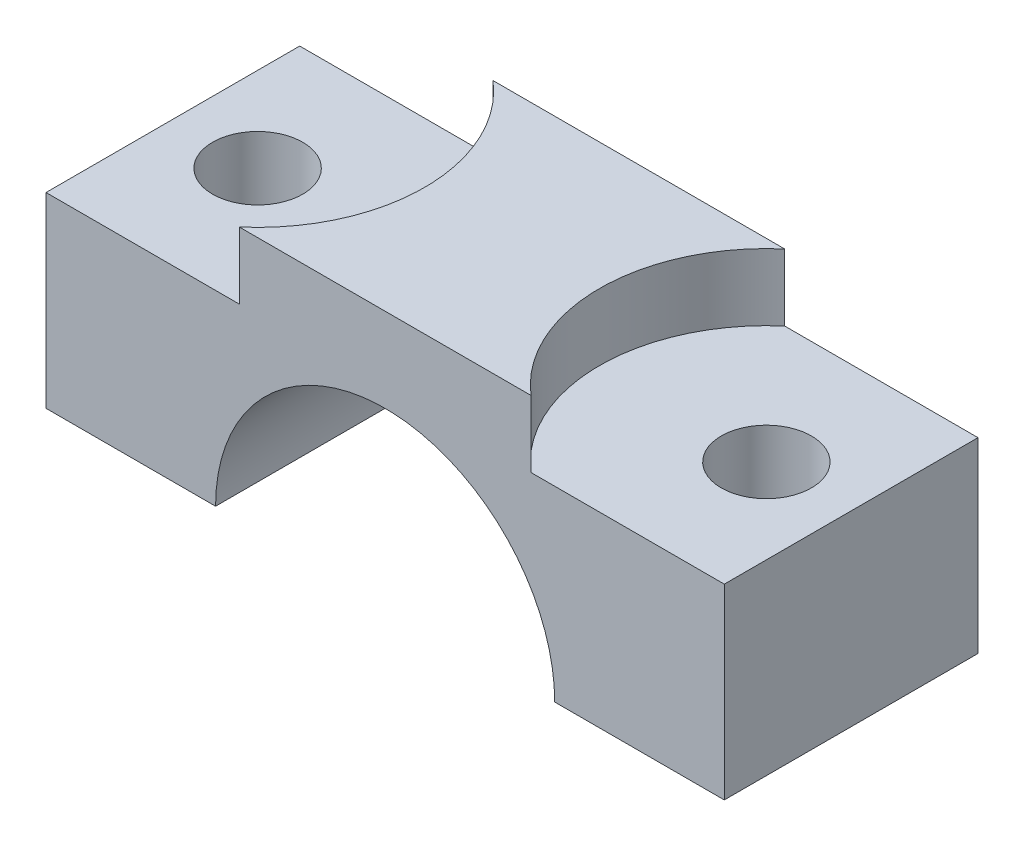
ISO-10303-21;
HEADER;
FILE_DESCRIPTION(('STEP AP214'),'2;1');
FILE_NAME('part.step','',(''),(''),'','','');
FILE_SCHEMA(('AUTOMOTIVE_DESIGN { 1 0 10303 214 1 1 1 1 }'));
ENDSEC;
DATA;
#1=APPLICATION_CONTEXT('core data for automotive mechanical design processes');
#2=APPLICATION_PROTOCOL_DEFINITION('international standard','automotive_design',2000,#1);
#3=PRODUCT_CONTEXT('',#1,'mechanical');
#4=PRODUCT('Part','Part','',(#3));
#5=PRODUCT_RELATED_PRODUCT_CATEGORY('part','',(#4));
#6=PRODUCT_DEFINITION_FORMATION('','',#4);
#7=PRODUCT_DEFINITION_CONTEXT('part definition',#1,'design');
#8=PRODUCT_DEFINITION('design','',#6,#7);
#9=PRODUCT_DEFINITION_SHAPE('','',#8);
#10=(LENGTH_UNIT() NAMED_UNIT(*) SI_UNIT(.MILLI.,.METRE.));
#11=(NAMED_UNIT(*) PLANE_ANGLE_UNIT() SI_UNIT($,.RADIAN.));
#12=(NAMED_UNIT(*) SI_UNIT($,.STERADIAN.) SOLID_ANGLE_UNIT());
#13=UNCERTAINTY_MEASURE_WITH_UNIT(LENGTH_MEASURE(1.E-05),#10,'distance_accuracy_value','');
#14=(GEOMETRIC_REPRESENTATION_CONTEXT(3) GLOBAL_UNCERTAINTY_ASSIGNED_CONTEXT((#13)) GLOBAL_UNIT_ASSIGNED_CONTEXT((#10,
#11,#12)) REPRESENTATION_CONTEXT('',''));
#15=CARTESIAN_POINT('',(0.,0.,0.));
#16=DIRECTION('',(0.,0.,1.));
#17=DIRECTION('',(1.,0.,0.));
#18=AXIS2_PLACEMENT_3D('',#15,#16,#17);
#19=CARTESIAN_POINT('',(-25.4,0.,9.5));
#20=DIRECTION('',(-1.,0.,0.));
#21=DIRECTION('',(0.,0.,1.));
#22=AXIS2_PLACEMENT_3D('',#19,#20,#21);
#23=PLANE('',#22);
#24=DIRECTION('',(0.,0.,1.));
#25=VECTOR('',#24,1.);
#26=CARTESIAN_POINT('',(-25.4,14.,9.5));
#27=LINE('',#26,#25);
#28=CARTESIAN_POINT('',(-25.4,14.,-9.5));
#29=VERTEX_POINT('',#28);
#30=CARTESIAN_POINT('',(-25.4,14.,9.5));
#31=VERTEX_POINT('',#30);
#32=EDGE_CURVE('E146',#29,#31,#27,.T.);
#33=ORIENTED_EDGE('',*,*,#32,.F.);
#34=DIRECTION('',(0.,1.,0.));
#35=VECTOR('',#34,1.);
#36=CARTESIAN_POINT('',(-25.4,0.,-9.5));
#37=LINE('',#36,#35);
#38=CARTESIAN_POINT('',(-25.4,0.,-9.5));
#39=VERTEX_POINT('',#38);
#40=EDGE_CURVE('E150',#39,#29,#37,.T.);
#41=ORIENTED_EDGE('',*,*,#40,.F.);
#42=DIRECTION('',(0.,0.,-1.));
#43=VECTOR('',#42,1.);
#44=CARTESIAN_POINT('',(-25.4,0.,9.5));
#45=LINE('',#44,#43);
#46=CARTESIAN_POINT('',(-25.4,0.,9.5));
#47=VERTEX_POINT('',#46);
#48=EDGE_CURVE('E178',#47,#39,#45,.T.);
#49=ORIENTED_EDGE('',*,*,#48,.F.);
#50=DIRECTION('',(0.,1.,0.));
#51=VECTOR('',#50,1.);
#52=CARTESIAN_POINT('',(-25.4,0.,9.5));
#53=LINE('',#52,#51);
#54=EDGE_CURVE('E151',#47,#31,#53,.T.);
#55=ORIENTED_EDGE('',*,*,#54,.T.);
#56=EDGE_LOOP('',(#33,#41,#49,#55));
#57=FACE_BOUND('',#56,.T.);
#58=ADVANCED_FACE('F36',(#57),#23,.T.);
#59=CARTESIAN_POINT('',(-25.4,0.,9.5));
#60=DIRECTION('',(0.,1.,0.));
#61=DIRECTION('',(0.,0.,1.));
#62=AXIS2_PLACEMENT_3D('',#59,#60,#61);
#63=PLANE('',#62);
#64=CARTESIAN_POINT('',(-19.05,0.,0.));
#65=DIRECTION('',(0.,1.,0.));
#66=DIRECTION('',(0.,0.,1.));
#67=AXIS2_PLACEMENT_3D('',#64,#65,#66);
#68=CIRCLE('',#67,3.375);
#69=CARTESIAN_POINT('',(-19.05,0.,3.375));
#70=VERTEX_POINT('',#69);
#71=EDGE_CURVE('E141',#70,#70,#68,.T.);
#72=ORIENTED_EDGE('',*,*,#71,.T.);
#73=EDGE_LOOP('',(#72));
#74=FACE_BOUND('',#73,.T.);
#75=DIRECTION('',(1.,0.,0.));
#76=VECTOR('',#75,1.);
#77=CARTESIAN_POINT('',(-25.4,0.,-9.5));
#78=LINE('',#77,#76);
#79=CARTESIAN_POINT('',(-12.7,0.,-9.5));
#80=VERTEX_POINT('',#79);
#81=EDGE_CURVE('E155',#39,#80,#78,.T.);
#82=ORIENTED_EDGE('',*,*,#81,.T.);
#83=DIRECTION('',(0.,0.,-1.));
#84=VECTOR('',#83,1.);
#85=CARTESIAN_POINT('',(-12.7,0.,9.5));
#86=LINE('',#85,#84);
#87=CARTESIAN_POINT('',(-12.7,0.,9.5));
#88=VERTEX_POINT('',#87);
#89=EDGE_CURVE('E181',#88,#80,#86,.T.);
#90=ORIENTED_EDGE('',*,*,#89,.F.);
#91=DIRECTION('',(1.,0.,0.));
#92=VECTOR('',#91,1.);
#93=CARTESIAN_POINT('',(-25.4,0.,9.5));
#94=LINE('',#93,#92);
#95=EDGE_CURVE('E162',#47,#88,#94,.T.);
#96=ORIENTED_EDGE('',*,*,#95,.F.);
#97=ORIENTED_EDGE('',*,*,#48,.T.);
#98=EDGE_LOOP('',(#82,#90,#96,#97));
#99=FACE_BOUND('',#98,.T.);
#100=ADVANCED_FACE('F214',(#74,#99),#63,.F.);
#101=CARTESIAN_POINT('',(0.,0.,9.5));
#102=DIRECTION('',(0.,0.,-1.));
#103=DIRECTION('',(-1.,0.,0.));
#104=AXIS2_PLACEMENT_3D('',#101,#102,#103);
#105=CYLINDRICAL_SURFACE('',#104,12.7);
#106=CARTESIAN_POINT('',(0.,0.,-9.5));
#107=DIRECTION('',(0.,0.,-1.));
#108=DIRECTION('',(-1.,0.,0.));
#109=AXIS2_PLACEMENT_3D('',#106,#107,#108);
#110=CIRCLE('',#109,12.7);
#111=CARTESIAN_POINT('',(12.7,0.,-9.5));
#112=VERTEX_POINT('',#111);
#113=EDGE_CURVE('E175',#80,#112,#110,.T.);
#114=ORIENTED_EDGE('',*,*,#113,.T.);
#115=DIRECTION('',(0.,0.,-1.));
#116=VECTOR('',#115,1.);
#117=CARTESIAN_POINT('',(12.7,0.,9.5));
#118=LINE('',#117,#116);
#119=CARTESIAN_POINT('',(12.7,0.,9.5));
#120=VERTEX_POINT('',#119);
#121=EDGE_CURVE('E184',#120,#112,#118,.T.);
#122=ORIENTED_EDGE('',*,*,#121,.F.);
#123=CARTESIAN_POINT('',(0.,0.,9.5));
#124=DIRECTION('',(0.,0.,-1.));
#125=DIRECTION('',(-1.,0.,0.));
#126=AXIS2_PLACEMENT_3D('',#123,#124,#125);
#127=CIRCLE('',#126,12.7);
#128=EDGE_CURVE('E160',#88,#120,#127,.T.);
#129=ORIENTED_EDGE('',*,*,#128,.F.);
#130=ORIENTED_EDGE('',*,*,#89,.T.);
#131=EDGE_LOOP('',(#114,#122,#129,#130));
#132=FACE_BOUND('',#131,.T.);
#133=ADVANCED_FACE('F220',(#132),#105,.F.);
#134=CARTESIAN_POINT('',(12.7,0.,9.5));
#135=DIRECTION('',(0.,1.,0.));
#136=DIRECTION('',(0.,0.,1.));
#137=AXIS2_PLACEMENT_3D('',#134,#135,#136);
#138=PLANE('',#137);
#139=CARTESIAN_POINT('',(19.05,0.,0.));
#140=DIRECTION('',(0.,1.,0.));
#141=DIRECTION('',(0.,0.,1.));
#142=AXIS2_PLACEMENT_3D('',#139,#140,#141);
#143=CIRCLE('',#142,3.375);
#144=CARTESIAN_POINT('',(19.05,0.,3.375));
#145=VERTEX_POINT('',#144);
#146=EDGE_CURVE('E118',#145,#145,#143,.T.);
#147=ORIENTED_EDGE('',*,*,#146,.T.);
#148=EDGE_LOOP('',(#147));
#149=FACE_BOUND('',#148,.T.);
#150=DIRECTION('',(1.,0.,0.));
#151=VECTOR('',#150,1.);
#152=CARTESIAN_POINT('',(12.7,0.,-9.5));
#153=LINE('',#152,#151);
#154=CARTESIAN_POINT('',(25.4,0.,-9.5));
#155=VERTEX_POINT('',#154);
#156=EDGE_CURVE('E173',#112,#155,#153,.T.);
#157=ORIENTED_EDGE('',*,*,#156,.T.);
#158=DIRECTION('',(0.,0.,-1.));
#159=VECTOR('',#158,1.);
#160=CARTESIAN_POINT('',(25.4,0.,9.5));
#161=LINE('',#160,#159);
#162=CARTESIAN_POINT('',(25.4,0.,9.5));
#163=VERTEX_POINT('',#162);
#164=EDGE_CURVE('E164',#163,#155,#161,.T.);
#165=ORIENTED_EDGE('',*,*,#164,.F.);
#166=DIRECTION('',(1.,0.,0.));
#167=VECTOR('',#166,1.);
#168=CARTESIAN_POINT('',(12.7,0.,9.5));
#169=LINE('',#168,#167);
#170=EDGE_CURVE('E158',#120,#163,#169,.T.);
#171=ORIENTED_EDGE('',*,*,#170,.F.);
#172=ORIENTED_EDGE('',*,*,#121,.T.);
#173=EDGE_LOOP('',(#157,#165,#171,#172));
#174=FACE_BOUND('',#173,.T.);
#175=ADVANCED_FACE('F224',(#149,#174),#138,.F.);
#176=CARTESIAN_POINT('',(25.4,0.,9.5));
#177=DIRECTION('',(-1.,0.,0.));
#178=DIRECTION('',(0.,0.,1.));
#179=AXIS2_PLACEMENT_3D('',#176,#177,#178);
#180=PLANE('',#179);
#181=DIRECTION('',(0.,1.,0.));
#182=VECTOR('',#181,1.);
#183=CARTESIAN_POINT('',(25.4,0.,-9.5));
#184=LINE('',#183,#182);
#185=CARTESIAN_POINT('',(25.4,14.,-9.5));
#186=VERTEX_POINT('',#185);
#187=EDGE_CURVE('E170',#155,#186,#184,.T.);
#188=ORIENTED_EDGE('',*,*,#187,.T.);
#189=DIRECTION('',(0.,0.,1.));
#190=VECTOR('',#189,1.);
#191=CARTESIAN_POINT('',(25.4,14.,9.5));
#192=LINE('',#191,#190);
#193=CARTESIAN_POINT('',(25.4,14.,9.5));
#194=VERTEX_POINT('',#193);
#195=EDGE_CURVE('E117',#186,#194,#192,.T.);
#196=ORIENTED_EDGE('',*,*,#195,.T.);
#197=DIRECTION('',(0.,1.,0.));
#198=VECTOR('',#197,1.);
#199=CARTESIAN_POINT('',(25.4,0.,9.5));
#200=LINE('',#199,#198);
#201=EDGE_CURVE('E131',#163,#194,#200,.T.);
#202=ORIENTED_EDGE('',*,*,#201,.F.);
#203=ORIENTED_EDGE('',*,*,#164,.T.);
#204=EDGE_LOOP('',(#188,#196,#202,#203));
#205=FACE_BOUND('',#204,.T.);
#206=ADVANCED_FACE('F227',(#205),#180,.F.);
#207=CARTESIAN_POINT('',(-25.4,19.,9.5));
#208=DIRECTION('',(0.,1.,0.));
#209=DIRECTION('',(0.,0.,1.));
#210=AXIS2_PLACEMENT_3D('',#207,#208,#209);
#211=PLANE('',#210);
#212=CARTESIAN_POINT('',(19.05,19.,0.));
#213=DIRECTION('',(0.,1.,0.));
#214=DIRECTION('',(0.,0.,1.));
#215=AXIS2_PLACEMENT_3D('',#212,#213,#214);
#216=CIRCLE('',#215,12.5);
#217=CARTESIAN_POINT('',(10.925961595364,19.,-9.5));
#218=VERTEX_POINT('',#217);
#219=CARTESIAN_POINT('',(10.925961595364,19.,9.5));
#220=VERTEX_POINT('',#219);
#221=EDGE_CURVE('E112',#218,#220,#216,.T.);
#222=ORIENTED_EDGE('',*,*,#221,.F.);
#223=DIRECTION('',(1.,0.,0.));
#224=VECTOR('',#223,1.);
#225=CARTESIAN_POINT('',(-25.4,19.,-9.5));
#226=LINE('',#225,#224);
#227=CARTESIAN_POINT('',(-10.925961595364,19.,-9.5));
#228=VERTEX_POINT('',#227);
#229=EDGE_CURVE('E167',#228,#218,#226,.T.);
#230=ORIENTED_EDGE('',*,*,#229,.F.);
#231=CARTESIAN_POINT('',(-19.05,19.,0.));
#232=DIRECTION('',(0.,1.,0.));
#233=DIRECTION('',(0.,0.,1.));
#234=AXIS2_PLACEMENT_3D('',#231,#232,#233);
#235=CIRCLE('',#234,12.5);
#236=CARTESIAN_POINT('',(-10.925961595364,19.,9.5));
#237=VERTEX_POINT('',#236);
#238=EDGE_CURVE('E132',#237,#228,#235,.T.);
#239=ORIENTED_EDGE('',*,*,#238,.F.);
#240=DIRECTION('',(1.,0.,0.));
#241=VECTOR('',#240,1.);
#242=CARTESIAN_POINT('',(-25.4,19.,9.5));
#243=LINE('',#242,#241);
#244=EDGE_CURVE('E154',#237,#220,#243,.T.);
#245=ORIENTED_EDGE('',*,*,#244,.T.);
#246=EDGE_LOOP('',(#222,#230,#239,#245));
#247=FACE_BOUND('',#246,.T.);
#248=ADVANCED_FACE('F196',(#247),#211,.T.);
#249=CARTESIAN_POINT('',(0.,0.,9.5));
#250=DIRECTION('',(0.,0.,-1.));
#251=DIRECTION('',(-1.,0.,0.));
#252=AXIS2_PLACEMENT_3D('',#249,#250,#251);
#253=PLANE('',#252);
#254=DIRECTION('',(-1.,0.,0.));
#255=VECTOR('',#254,1.);
#256=CARTESIAN_POINT('',(0.,14.,9.5));
#257=LINE('',#256,#255);
#258=CARTESIAN_POINT('',(10.925961595364,14.,9.5));
#259=VERTEX_POINT('',#258);
#260=EDGE_CURVE('E122',#194,#259,#257,.T.);
#261=ORIENTED_EDGE('',*,*,#260,.T.);
#262=DIRECTION('',(0.,1.,0.));
#263=VECTOR('',#262,1.);
#264=CARTESIAN_POINT('',(10.925961595364,19.,9.5));
#265=LINE('',#264,#263);
#266=EDGE_CURVE('E109',#259,#220,#265,.T.);
#267=ORIENTED_EDGE('',*,*,#266,.T.);
#268=ORIENTED_EDGE('',*,*,#244,.F.);
#269=DIRECTION('',(0.,1.,0.));
#270=VECTOR('',#269,1.);
#271=CARTESIAN_POINT('',(-10.925961595364,19.,9.5));
#272=LINE('',#271,#270);
#273=CARTESIAN_POINT('',(-10.925961595364,14.,9.5));
#274=VERTEX_POINT('',#273);
#275=EDGE_CURVE('E180',#237,#274,#272,.F.);
#276=ORIENTED_EDGE('',*,*,#275,.T.);
#277=DIRECTION('',(-1.,0.,0.));
#278=VECTOR('',#277,1.);
#279=CARTESIAN_POINT('',(0.,14.,9.5));
#280=LINE('',#279,#278);
#281=EDGE_CURVE('E191',#274,#31,#280,.T.);
#282=ORIENTED_EDGE('',*,*,#281,.T.);
#283=ORIENTED_EDGE('',*,*,#54,.F.);
#284=ORIENTED_EDGE('',*,*,#95,.T.);
#285=ORIENTED_EDGE('',*,*,#128,.T.);
#286=ORIENTED_EDGE('',*,*,#170,.T.);
#287=ORIENTED_EDGE('',*,*,#201,.T.);
#288=EDGE_LOOP('',(#261,#267,#268,#276,#282,#283,#284,#285,#286,#287));
#289=FACE_BOUND('',#288,.T.);
#290=ADVANCED_FACE('F129',(#289),#253,.F.);
#291=CARTESIAN_POINT('',(0.,0.,-9.5));
#292=DIRECTION('',(0.,0.,-1.));
#293=DIRECTION('',(-1.,0.,0.));
#294=AXIS2_PLACEMENT_3D('',#291,#292,#293);
#295=PLANE('',#294);
#296=DIRECTION('',(-1.,0.,0.));
#297=VECTOR('',#296,1.);
#298=CARTESIAN_POINT('',(0.,14.,-9.5));
#299=LINE('',#298,#297);
#300=CARTESIAN_POINT('',(10.925961595364,14.,-9.5));
#301=VERTEX_POINT('',#300);
#302=EDGE_CURVE('E11',#186,#301,#299,.T.);
#303=ORIENTED_EDGE('',*,*,#302,.F.);
#304=ORIENTED_EDGE('',*,*,#187,.F.);
#305=ORIENTED_EDGE('',*,*,#156,.F.);
#306=ORIENTED_EDGE('',*,*,#113,.F.);
#307=ORIENTED_EDGE('',*,*,#81,.F.);
#308=ORIENTED_EDGE('',*,*,#40,.T.);
#309=DIRECTION('',(-1.,0.,0.));
#310=VECTOR('',#309,1.);
#311=CARTESIAN_POINT('',(0.,14.,-9.5));
#312=LINE('',#311,#310);
#313=CARTESIAN_POINT('',(-10.925961595364,14.,-9.5));
#314=VERTEX_POINT('',#313);
#315=EDGE_CURVE('E148',#314,#29,#312,.T.);
#316=ORIENTED_EDGE('',*,*,#315,.F.);
#317=DIRECTION('',(0.,1.,0.));
#318=VECTOR('',#317,1.);
#319=CARTESIAN_POINT('',(-10.925961595364,19.,-9.5));
#320=LINE('',#319,#318);
#321=EDGE_CURVE('E144',#228,#314,#320,.F.);
#322=ORIENTED_EDGE('',*,*,#321,.F.);
#323=ORIENTED_EDGE('',*,*,#229,.T.);
#324=DIRECTION('',(0.,1.,0.));
#325=VECTOR('',#324,1.);
#326=CARTESIAN_POINT('',(10.925961595364,19.,-9.5));
#327=LINE('',#326,#325);
#328=EDGE_CURVE('E43',#301,#218,#327,.T.);
#329=ORIENTED_EDGE('',*,*,#328,.F.);
#330=EDGE_LOOP('',(#303,#304,#305,#306,#307,#308,#316,#322,#323,#329));
#331=FACE_BOUND('',#330,.T.);
#332=ADVANCED_FACE('F200',(#331),#295,.T.);
#333=CARTESIAN_POINT('',(-19.05,19.,0.));
#334=DIRECTION('',(0.,1.,0.));
#335=DIRECTION('',(0.,0.,1.));
#336=AXIS2_PLACEMENT_3D('',#333,#334,#335);
#337=CYLINDRICAL_SURFACE('',#336,3.375);
#338=ORIENTED_EDGE('',*,*,#71,.F.);
#339=EDGE_LOOP('',(#338));
#340=FACE_BOUND('',#339,.T.);
#341=CARTESIAN_POINT('',(-19.05,14.,0.));
#342=DIRECTION('',(0.,1.,0.));
#343=DIRECTION('',(0.,0.,1.));
#344=AXIS2_PLACEMENT_3D('',#341,#342,#343);
#345=CIRCLE('',#344,3.375);
#346=CARTESIAN_POINT('',(-19.05,14.,3.375));
#347=VERTEX_POINT('',#346);
#348=EDGE_CURVE('E138',#347,#347,#345,.T.);
#349=ORIENTED_EDGE('',*,*,#348,.T.);
#350=EDGE_LOOP('',(#349));
#351=FACE_BOUND('',#350,.T.);
#352=ADVANCED_FACE('F249',(#340,#351),#337,.F.);
#353=CARTESIAN_POINT('',(-15.675,14.,0.));
#354=DIRECTION('',(0.,-1.,0.));
#355=DIRECTION('',(0.,0.,-1.));
#356=AXIS2_PLACEMENT_3D('',#353,#354,#355);
#357=PLANE('',#356);
#358=ORIENTED_EDGE('',*,*,#315,.T.);
#359=ORIENTED_EDGE('',*,*,#32,.T.);
#360=ORIENTED_EDGE('',*,*,#281,.F.);
#361=CARTESIAN_POINT('',(-19.05,14.,0.));
#362=DIRECTION('',(0.,1.,0.));
#363=DIRECTION('',(0.,0.,1.));
#364=AXIS2_PLACEMENT_3D('',#361,#362,#363);
#365=CIRCLE('',#364,12.5);
#366=EDGE_CURVE('E57',#274,#314,#365,.T.);
#367=ORIENTED_EDGE('',*,*,#366,.T.);
#368=EDGE_LOOP('',(#358,#359,#360,#367));
#369=FACE_BOUND('',#368,.T.);
#370=ORIENTED_EDGE('',*,*,#348,.F.);
#371=EDGE_LOOP('',(#370));
#372=FACE_BOUND('',#371,.T.);
#373=ADVANCED_FACE('F204',(#369,#372),#357,.F.);
#374=CARTESIAN_POINT('',(-19.05,19.,0.));
#375=DIRECTION('',(0.,1.,0.));
#376=DIRECTION('',(0.,0.,1.));
#377=AXIS2_PLACEMENT_3D('',#374,#375,#376);
#378=CYLINDRICAL_SURFACE('',#377,12.5);
#379=ORIENTED_EDGE('',*,*,#321,.T.);
#380=ORIENTED_EDGE('',*,*,#366,.F.);
#381=ORIENTED_EDGE('',*,*,#275,.F.);
#382=ORIENTED_EDGE('',*,*,#238,.T.);
#383=EDGE_LOOP('',(#379,#380,#381,#382));
#384=FACE_BOUND('',#383,.T.);
#385=ADVANCED_FACE('F202',(#384),#378,.F.);
#386=CARTESIAN_POINT('',(22.425,14.,0.));
#387=DIRECTION('',(0.,-1.,0.));
#388=DIRECTION('',(0.,0.,-1.));
#389=AXIS2_PLACEMENT_3D('',#386,#387,#388);
#390=PLANE('',#389);
#391=CARTESIAN_POINT('',(19.05,14.,0.));
#392=DIRECTION('',(0.,1.,0.));
#393=DIRECTION('',(0.,0.,1.));
#394=AXIS2_PLACEMENT_3D('',#391,#392,#393);
#395=CIRCLE('',#394,3.375);
#396=CARTESIAN_POINT('',(19.05,14.,3.375));
#397=VERTEX_POINT('',#396);
#398=EDGE_CURVE('E126',#397,#397,#395,.T.);
#399=ORIENTED_EDGE('',*,*,#398,.F.);
#400=EDGE_LOOP('',(#399));
#401=FACE_BOUND('',#400,.T.);
#402=ORIENTED_EDGE('',*,*,#195,.F.);
#403=ORIENTED_EDGE('',*,*,#302,.T.);
#404=CARTESIAN_POINT('',(19.05,14.,0.));
#405=DIRECTION('',(0.,1.,0.));
#406=DIRECTION('',(0.,0.,1.));
#407=AXIS2_PLACEMENT_3D('',#404,#405,#406);
#408=CIRCLE('',#407,12.5);
#409=EDGE_CURVE('E50',#301,#259,#408,.T.);
#410=ORIENTED_EDGE('',*,*,#409,.T.);
#411=ORIENTED_EDGE('',*,*,#260,.F.);
#412=EDGE_LOOP('',(#402,#403,#410,#411));
#413=FACE_BOUND('',#412,.T.);
#414=ADVANCED_FACE('F121',(#401,#413),#390,.F.);
#415=CARTESIAN_POINT('',(19.05,19.,0.));
#416=DIRECTION('',(0.,1.,0.));
#417=DIRECTION('',(0.,0.,1.));
#418=AXIS2_PLACEMENT_3D('',#415,#416,#417);
#419=CYLINDRICAL_SURFACE('',#418,12.5);
#420=ORIENTED_EDGE('',*,*,#409,.F.);
#421=ORIENTED_EDGE('',*,*,#328,.T.);
#422=ORIENTED_EDGE('',*,*,#221,.T.);
#423=ORIENTED_EDGE('',*,*,#266,.F.);
#424=EDGE_LOOP('',(#420,#421,#422,#423));
#425=FACE_BOUND('',#424,.T.);
#426=ADVANCED_FACE('F110',(#425),#419,.F.);
#427=CARTESIAN_POINT('',(19.05,19.,0.));
#428=DIRECTION('',(0.,1.,0.));
#429=DIRECTION('',(0.,0.,1.));
#430=AXIS2_PLACEMENT_3D('',#427,#428,#429);
#431=CYLINDRICAL_SURFACE('',#430,3.375);
#432=ORIENTED_EDGE('',*,*,#146,.F.);
#433=EDGE_LOOP('',(#432));
#434=FACE_BOUND('',#433,.T.);
#435=ORIENTED_EDGE('',*,*,#398,.T.);
#436=EDGE_LOOP('',(#435));
#437=FACE_BOUND('',#436,.T.);
#438=ADVANCED_FACE('F259',(#434,#437),#431,.F.);
#439=CLOSED_SHELL('',(#58,#100,#133,#175,#206,#248,#290,#332,#352,#373,#385,#414,#426,#438));
#440=MANIFOLD_SOLID_BREP('B2',#439);
#441=ADVANCED_BREP_SHAPE_REPRESENTATION('',(#18,#440),#14);
#442=SHAPE_DEFINITION_REPRESENTATION(#9,#441);
ENDSEC;
END-ISO-10303-21;
